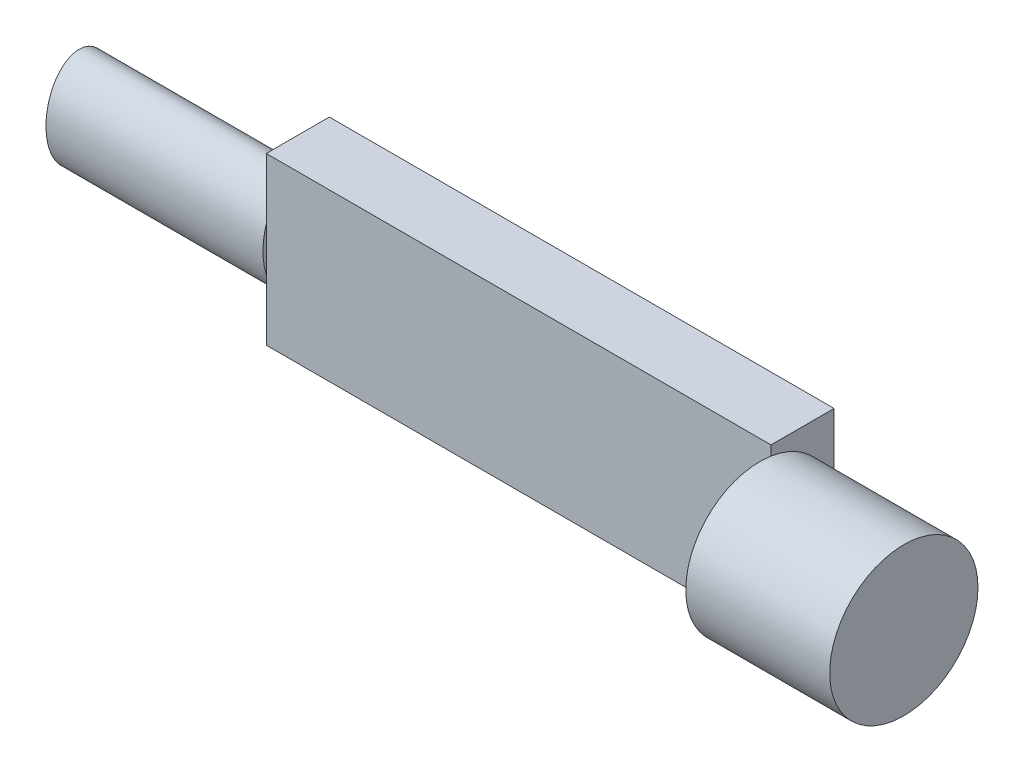
ISO-10303-21;
HEADER;
FILE_DESCRIPTION(('STEP AP214'),'2;1');
FILE_NAME('part.step','',(''),(''),'','','');
FILE_SCHEMA(('AUTOMOTIVE_DESIGN { 1 0 10303 214 1 1 1 1 }'));
ENDSEC;
DATA;
#1=APPLICATION_CONTEXT('core data for automotive mechanical design processes');
#2=APPLICATION_PROTOCOL_DEFINITION('international standard','automotive_design',2000,#1);
#3=PRODUCT_CONTEXT('',#1,'mechanical');
#4=PRODUCT('Part','Part','',(#3));
#5=PRODUCT_RELATED_PRODUCT_CATEGORY('part','',(#4));
#6=PRODUCT_DEFINITION_FORMATION('','',#4);
#7=PRODUCT_DEFINITION_CONTEXT('part definition',#1,'design');
#8=PRODUCT_DEFINITION('design','',#6,#7);
#9=PRODUCT_DEFINITION_SHAPE('','',#8);
#10=(LENGTH_UNIT() NAMED_UNIT(*) SI_UNIT(.MILLI.,.METRE.));
#11=(NAMED_UNIT(*) PLANE_ANGLE_UNIT() SI_UNIT($,.RADIAN.));
#12=(NAMED_UNIT(*) SI_UNIT($,.STERADIAN.) SOLID_ANGLE_UNIT());
#13=UNCERTAINTY_MEASURE_WITH_UNIT(LENGTH_MEASURE(1.E-05),#10,'distance_accuracy_value','');
#14=(GEOMETRIC_REPRESENTATION_CONTEXT(3) GLOBAL_UNCERTAINTY_ASSIGNED_CONTEXT((#13)) GLOBAL_UNIT_ASSIGNED_CONTEXT((#10,
#11,#12)) REPRESENTATION_CONTEXT('',''));
#15=CARTESIAN_POINT('',(0.,0.,0.));
#16=DIRECTION('',(0.,0.,1.));
#17=DIRECTION('',(1.,0.,0.));
#18=AXIS2_PLACEMENT_3D('',#15,#16,#17);
#19=CARTESIAN_POINT('',(0.,0.,2.85));
#20=DIRECTION('',(1.,0.,0.));
#21=DIRECTION('',(0.,0.,-1.));
#22=AXIS2_PLACEMENT_3D('',#19,#20,#21);
#23=PLANE('',#22);
#24=CARTESIAN_POINT('',(0.,3.75,1.5));
#25=DIRECTION('',(-1.,0.,0.));
#26=DIRECTION('',(0.,1.,0.));
#27=AXIS2_PLACEMENT_3D('',#24,#25,#26);
#28=ELLIPSE('',#27,2.25,1.5);
#29=CARTESIAN_POINT('',(0.,3.75,0.));
#30=VERTEX_POINT('',#29);
#31=CARTESIAN_POINT('',(0.,2.76924773770334,2.85));
#32=VERTEX_POINT('',#31);
#33=EDGE_CURVE('E44',#30,#32,#28,.T.);
#34=ORIENTED_EDGE('',*,*,#33,.F.);
#35=DIRECTION('',(0.,-1.,0.));
#36=VECTOR('',#35,1.);
#37=CARTESIAN_POINT('',(0.,0.,0.));
#38=LINE('',#37,#36);
#39=CARTESIAN_POINT('',(0.,0.,0.));
#40=VERTEX_POINT('',#39);
#41=EDGE_CURVE('E102',#30,#40,#38,.T.);
#42=ORIENTED_EDGE('',*,*,#41,.T.);
#43=DIRECTION('',(0.,0.,-1.));
#44=VECTOR('',#43,1.);
#45=CARTESIAN_POINT('',(0.,0.,2.85));
#46=LINE('',#45,#44);
#47=CARTESIAN_POINT('',(0.,0.,2.85));
#48=VERTEX_POINT('',#47);
#49=EDGE_CURVE('E37',#48,#40,#46,.T.);
#50=ORIENTED_EDGE('',*,*,#49,.F.);
#51=DIRECTION('',(0.,-1.,0.));
#52=VECTOR('',#51,1.);
#53=CARTESIAN_POINT('',(0.,0.,2.85));
#54=LINE('',#53,#52);
#55=EDGE_CURVE('E52',#32,#48,#54,.T.);
#56=ORIENTED_EDGE('',*,*,#55,.F.);
#57=EDGE_LOOP('',(#34,#42,#50,#56));
#58=FACE_BOUND('',#57,.T.);
#59=ADVANCED_FACE('F33',(#58),#23,.F.);
#60=CARTESIAN_POINT('',(22.8,0.,2.85));
#61=DIRECTION('',(-1.,0.,0.));
#62=DIRECTION('',(0.,0.,1.));
#63=AXIS2_PLACEMENT_3D('',#60,#61,#62);
#64=PLANE('',#63);
#65=CARTESIAN_POINT('',(22.8,3.75,3.35));
#66=DIRECTION('',(1.,0.,0.));
#67=DIRECTION('',(0.,0.,-1.));
#68=AXIS2_PLACEMENT_3D('',#65,#66,#67);
#69=CIRCLE('',#68,3.35);
#70=CARTESIAN_POINT('',(22.8,3.75,0.));
#71=VERTEX_POINT('',#70);
#72=CARTESIAN_POINT('',(22.8,7.06247641501038,2.85));
#73=VERTEX_POINT('',#72);
#74=EDGE_CURVE('E122',#71,#73,#69,.T.);
#75=ORIENTED_EDGE('',*,*,#74,.F.);
#76=DIRECTION('',(0.,1.,0.));
#77=VECTOR('',#76,1.);
#78=CARTESIAN_POINT('',(22.8,0.,0.));
#79=LINE('',#78,#77);
#80=CARTESIAN_POINT('',(22.8,7.5,0.));
#81=VERTEX_POINT('',#80);
#82=EDGE_CURVE('E139',#71,#81,#79,.T.);
#83=ORIENTED_EDGE('',*,*,#82,.T.);
#84=DIRECTION('',(0.,0.,-1.));
#85=VECTOR('',#84,1.);
#86=CARTESIAN_POINT('',(22.8,7.5,2.85));
#87=LINE('',#86,#85);
#88=CARTESIAN_POINT('',(22.8,7.5,2.85));
#89=VERTEX_POINT('',#88);
#90=EDGE_CURVE('E145',#89,#81,#87,.T.);
#91=ORIENTED_EDGE('',*,*,#90,.F.);
#92=DIRECTION('',(0.,1.,0.));
#93=VECTOR('',#92,1.);
#94=CARTESIAN_POINT('',(22.8,0.,2.85));
#95=LINE('',#94,#93);
#96=EDGE_CURVE('E131',#73,#89,#95,.T.);
#97=ORIENTED_EDGE('',*,*,#96,.F.);
#98=EDGE_LOOP('',(#75,#83,#91,#97));
#99=FACE_BOUND('',#98,.T.);
#100=ADVANCED_FACE('F178',(#99),#64,.F.);
#101=CARTESIAN_POINT('',(0.,4.73075226229666,2.85));
#102=VERTEX_POINT('',#101);
#103=EDGE_CURVE('E11',#102,#30,#28,.T.);
#104=ORIENTED_EDGE('',*,*,#103,.F.);
#105=CARTESIAN_POINT('',(0.,7.5,2.85));
#106=VERTEX_POINT('',#105);
#107=EDGE_CURVE('E126',#106,#102,#54,.T.);
#108=ORIENTED_EDGE('',*,*,#107,.F.);
#109=DIRECTION('',(0.,0.,-1.));
#110=VECTOR('',#109,1.);
#111=CARTESIAN_POINT('',(0.,7.5,2.85));
#112=LINE('',#111,#110);
#113=CARTESIAN_POINT('',(0.,7.5,0.));
#114=VERTEX_POINT('',#113);
#115=EDGE_CURVE('E98',#106,#114,#112,.T.);
#116=ORIENTED_EDGE('',*,*,#115,.T.);
#117=EDGE_CURVE('E95',#114,#30,#38,.T.);
#118=ORIENTED_EDGE('',*,*,#117,.T.);
#119=EDGE_LOOP('',(#104,#108,#116,#118));
#120=FACE_BOUND('',#119,.T.);
#121=ADVANCED_FACE('F35',(#120),#23,.F.);
#122=CARTESIAN_POINT('',(0.,0.,2.85));
#123=DIRECTION('',(0.,1.,0.));
#124=DIRECTION('',(0.,0.,1.));
#125=AXIS2_PLACEMENT_3D('',#122,#123,#124);
#126=PLANE('',#125);
#127=DIRECTION('',(1.,0.,0.));
#128=VECTOR('',#127,1.);
#129=CARTESIAN_POINT('',(0.,0.,0.));
#130=LINE('',#129,#128);
#131=CARTESIAN_POINT('',(22.8,0.,0.));
#132=VERTEX_POINT('',#131);
#133=EDGE_CURVE('E101',#40,#132,#130,.T.);
#134=ORIENTED_EDGE('',*,*,#133,.T.);
#135=DIRECTION('',(0.,0.,-1.));
#136=VECTOR('',#135,1.);
#137=CARTESIAN_POINT('',(22.8,0.,2.85));
#138=LINE('',#137,#136);
#139=CARTESIAN_POINT('',(22.8,0.,2.85));
#140=VERTEX_POINT('',#139);
#141=EDGE_CURVE('E147',#140,#132,#138,.T.);
#142=ORIENTED_EDGE('',*,*,#141,.F.);
#143=DIRECTION('',(1.,0.,0.));
#144=VECTOR('',#143,1.);
#145=CARTESIAN_POINT('',(0.,0.,2.85));
#146=LINE('',#145,#144);
#147=EDGE_CURVE('E128',#48,#140,#146,.T.);
#148=ORIENTED_EDGE('',*,*,#147,.F.);
#149=ORIENTED_EDGE('',*,*,#49,.T.);
#150=EDGE_LOOP('',(#134,#142,#148,#149));
#151=FACE_BOUND('',#150,.T.);
#152=ADVANCED_FACE('F186',(#151),#126,.F.);
#153=CARTESIAN_POINT('',(22.8,0.437523584989623,2.85));
#154=VERTEX_POINT('',#153);
#155=EDGE_CURVE('E42',#154,#71,#69,.T.);
#156=ORIENTED_EDGE('',*,*,#155,.F.);
#157=EDGE_CURVE('E132',#140,#154,#95,.T.);
#158=ORIENTED_EDGE('',*,*,#157,.F.);
#159=ORIENTED_EDGE('',*,*,#141,.T.);
#160=EDGE_CURVE('E140',#132,#71,#79,.T.);
#161=ORIENTED_EDGE('',*,*,#160,.T.);
#162=EDGE_LOOP('',(#156,#158,#159,#161));
#163=FACE_BOUND('',#162,.T.);
#164=ADVANCED_FACE('F184',(#163),#64,.F.);
#165=CARTESIAN_POINT('',(0.,7.5,2.85));
#166=DIRECTION('',(0.,-1.,0.));
#167=DIRECTION('',(0.,0.,-1.));
#168=AXIS2_PLACEMENT_3D('',#165,#166,#167);
#169=PLANE('',#168);
#170=DIRECTION('',(-1.,0.,0.));
#171=VECTOR('',#170,1.);
#172=CARTESIAN_POINT('',(0.,7.5,0.));
#173=LINE('',#172,#171);
#174=EDGE_CURVE('E142',#81,#114,#173,.T.);
#175=ORIENTED_EDGE('',*,*,#174,.T.);
#176=ORIENTED_EDGE('',*,*,#115,.F.);
#177=DIRECTION('',(-1.,0.,0.));
#178=VECTOR('',#177,1.);
#179=CARTESIAN_POINT('',(0.,7.5,2.85));
#180=LINE('',#179,#178);
#181=EDGE_CURVE('E135',#89,#106,#180,.T.);
#182=ORIENTED_EDGE('',*,*,#181,.F.);
#183=ORIENTED_EDGE('',*,*,#90,.T.);
#184=EDGE_LOOP('',(#175,#176,#182,#183));
#185=FACE_BOUND('',#184,.T.);
#186=ADVANCED_FACE('F193',(#185),#169,.F.);
#187=CARTESIAN_POINT('',(0.,0.,2.85));
#188=DIRECTION('',(0.,0.,-1.));
#189=DIRECTION('',(-1.,0.,0.));
#190=AXIS2_PLACEMENT_3D('',#187,#188,#189);
#191=PLANE('',#190);
#192=ORIENTED_EDGE('',*,*,#107,.T.);
#193=EDGE_CURVE('E129',#102,#32,#54,.T.);
#194=ORIENTED_EDGE('',*,*,#193,.T.);
#195=ORIENTED_EDGE('',*,*,#55,.T.);
#196=ORIENTED_EDGE('',*,*,#147,.T.);
#197=ORIENTED_EDGE('',*,*,#157,.T.);
#198=EDGE_CURVE('E136',#154,#73,#95,.T.);
#199=ORIENTED_EDGE('',*,*,#198,.T.);
#200=ORIENTED_EDGE('',*,*,#96,.T.);
#201=ORIENTED_EDGE('',*,*,#181,.T.);
#202=EDGE_LOOP('',(#192,#194,#195,#196,#197,#199,#200,#201));
#203=FACE_BOUND('',#202,.T.);
#204=ADVANCED_FACE('F197',(#203),#191,.F.);
#205=CARTESIAN_POINT('',(0.,0.,0.));
#206=DIRECTION('',(0.,0.,-1.));
#207=DIRECTION('',(-1.,0.,0.));
#208=AXIS2_PLACEMENT_3D('',#205,#206,#207);
#209=PLANE('',#208);
#210=ORIENTED_EDGE('',*,*,#117,.F.);
#211=ORIENTED_EDGE('',*,*,#174,.F.);
#212=ORIENTED_EDGE('',*,*,#82,.F.);
#213=ORIENTED_EDGE('',*,*,#160,.F.);
#214=ORIENTED_EDGE('',*,*,#133,.F.);
#215=ORIENTED_EDGE('',*,*,#41,.F.);
#216=EDGE_LOOP('',(#210,#211,#212,#213,#214,#215));
#217=FACE_BOUND('',#216,.T.);
#218=ADVANCED_FACE('F105',(#217),#209,.T.);
#219=CARTESIAN_POINT('',(29.3,3.75,3.35));
#220=DIRECTION('',(-1.,0.,0.));
#221=DIRECTION('',(0.,0.,1.));
#222=AXIS2_PLACEMENT_3D('',#219,#220,#221);
#223=CYLINDRICAL_SURFACE('',#222,3.35);
#224=CARTESIAN_POINT('',(29.3,3.75,3.35));
#225=DIRECTION('',(1.,0.,0.));
#226=DIRECTION('',(0.,0.,-1.));
#227=AXIS2_PLACEMENT_3D('',#224,#225,#226);
#228=CIRCLE('',#227,3.35);
#229=CARTESIAN_POINT('',(29.3,3.75,0.));
#230=VERTEX_POINT('',#229);
#231=EDGE_CURVE('E108',#230,#230,#228,.T.);
#232=ORIENTED_EDGE('',*,*,#231,.F.);
#233=EDGE_LOOP('',(#232));
#234=FACE_BOUND('',#233,.T.);
#235=ORIENTED_EDGE('',*,*,#74,.T.);
#236=EDGE_CURVE('E125',#73,#154,#69,.T.);
#237=ORIENTED_EDGE('',*,*,#236,.T.);
#238=ORIENTED_EDGE('',*,*,#155,.T.);
#239=EDGE_LOOP('',(#235,#237,#238));
#240=FACE_BOUND('',#239,.T.);
#241=ADVANCED_FACE('F201',(#234,#240),#223,.T.);
#242=CARTESIAN_POINT('',(29.3,3.75,3.35));
#243=DIRECTION('',(1.,0.,0.));
#244=DIRECTION('',(0.,0.,-1.));
#245=AXIS2_PLACEMENT_3D('',#242,#243,#244);
#246=PLANE('',#245);
#247=ORIENTED_EDGE('',*,*,#231,.T.);
#248=EDGE_LOOP('',(#247));
#249=FACE_BOUND('',#248,.T.);
#250=ADVANCED_FACE('F172',(#249),#246,.T.);
#251=CARTESIAN_POINT('',(22.8,3.75,3.35));
#252=DIRECTION('',(1.,0.,0.));
#253=DIRECTION('',(0.,0.,-1.));
#254=AXIS2_PLACEMENT_3D('',#251,#252,#253);
#255=PLANE('',#254);
#256=ORIENTED_EDGE('',*,*,#198,.F.);
#257=ORIENTED_EDGE('',*,*,#236,.F.);
#258=EDGE_LOOP('',(#256,#257));
#259=FACE_BOUND('',#258,.T.);
#260=ADVANCED_FACE('F164',(#259),#255,.F.);
#261=CARTESIAN_POINT('',(-9.8,3.75,1.5));
#262=DIRECTION('',(-1.,0.,0.));
#263=DIRECTION('',(0.,1.,0.));
#264=AXIS2_PLACEMENT_3D('',#261,#262,#263);
#265=ELLIPSE('',#264,2.25,1.5);
#266=DIRECTION('',(1.,0.,0.));
#267=VECTOR('',#266,1.);
#268=SURFACE_OF_LINEAR_EXTRUSION('',#265,#267);
#269=CARTESIAN_POINT('',(-9.8,6.,1.5));
#270=VERTEX_POINT('',#269);
#271=EDGE_CURVE('E112',#270,#270,#265,.T.);
#272=ORIENTED_EDGE('',*,*,#271,.F.);
#273=EDGE_LOOP('',(#272));
#274=FACE_BOUND('',#273,.T.);
#275=ORIENTED_EDGE('',*,*,#33,.T.);
#276=EDGE_CURVE('E45',#32,#102,#28,.T.);
#277=ORIENTED_EDGE('',*,*,#276,.T.);
#278=ORIENTED_EDGE('',*,*,#103,.T.);
#279=EDGE_LOOP('',(#275,#277,#278));
#280=FACE_BOUND('',#279,.T.);
#281=ADVANCED_FACE('F113',(#274,#280),#268,.F.);
#282=CARTESIAN_POINT('',(-9.8,3.75,1.5));
#283=DIRECTION('',(-1.,0.,0.));
#284=DIRECTION('',(0.,0.,1.));
#285=AXIS2_PLACEMENT_3D('',#282,#283,#284);
#286=PLANE('',#285);
#287=ORIENTED_EDGE('',*,*,#271,.T.);
#288=EDGE_LOOP('',(#287));
#289=FACE_BOUND('',#288,.T.);
#290=ADVANCED_FACE('F161',(#289),#286,.T.);
#291=CARTESIAN_POINT('',(0.,3.75,1.5));
#292=DIRECTION('',(-1.,0.,0.));
#293=DIRECTION('',(0.,0.,1.));
#294=AXIS2_PLACEMENT_3D('',#291,#292,#293);
#295=PLANE('',#294);
#296=ORIENTED_EDGE('',*,*,#193,.F.);
#297=ORIENTED_EDGE('',*,*,#276,.F.);
#298=EDGE_LOOP('',(#296,#297));
#299=FACE_BOUND('',#298,.T.);
#300=ADVANCED_FACE('F170',(#299),#295,.F.);
#301=CLOSED_SHELL('',(#59,#100,#121,#152,#164,#186,#204,#218,#241,#250,#260,#281,#290,#300));
#302=MANIFOLD_SOLID_BREP('B2',#301);
#303=ADVANCED_BREP_SHAPE_REPRESENTATION('',(#18,#302),#14);
#304=SHAPE_DEFINITION_REPRESENTATION(#9,#303);
ENDSEC;
END-ISO-10303-21;
